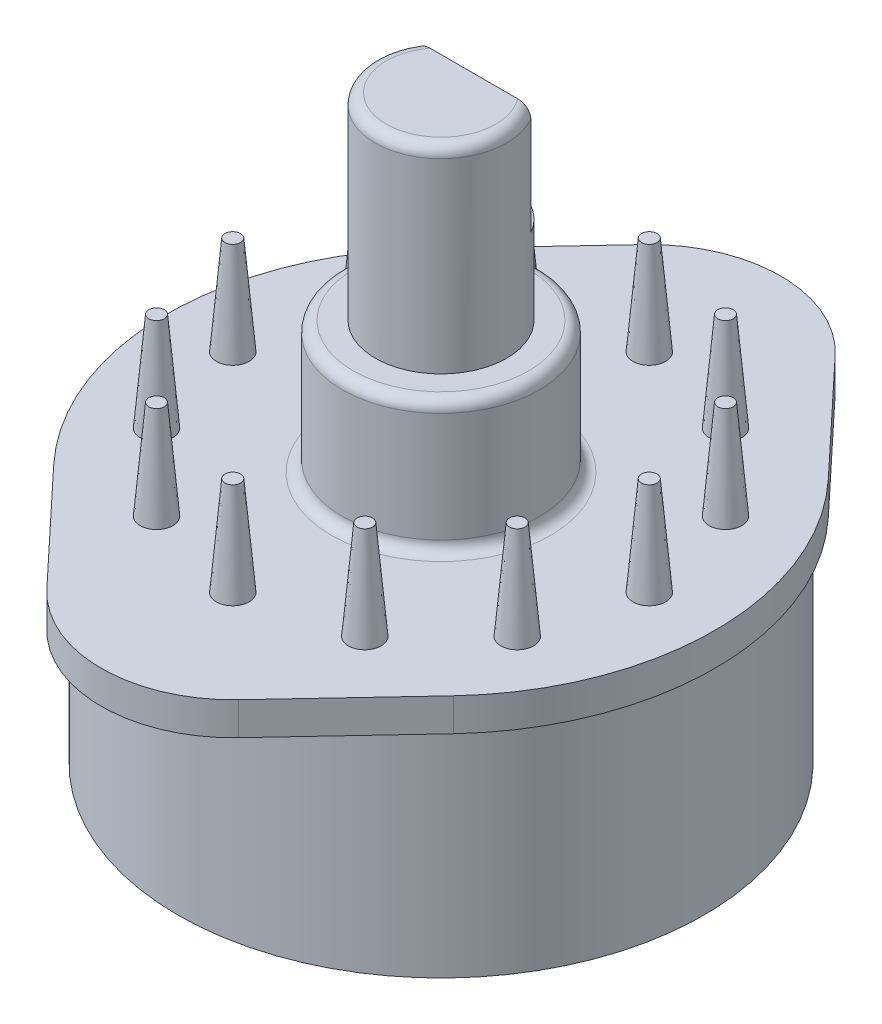
ISO-10303-21;
HEADER;
FILE_DESCRIPTION(('STEP AP214'),'2;1');
FILE_NAME('part.step','',(''),(''),'','','');
FILE_SCHEMA(('AUTOMOTIVE_DESIGN { 1 0 10303 214 1 1 1 1 }'));
ENDSEC;
DATA;
#1=APPLICATION_CONTEXT('core data for automotive mechanical design processes');
#2=APPLICATION_PROTOCOL_DEFINITION('international standard','automotive_design',2000,#1);
#3=PRODUCT_CONTEXT('',#1,'mechanical');
#4=PRODUCT('Part','Part','',(#3));
#5=PRODUCT_RELATED_PRODUCT_CATEGORY('part','',(#4));
#6=PRODUCT_DEFINITION_FORMATION('','',#4);
#7=PRODUCT_DEFINITION_CONTEXT('part definition',#1,'design');
#8=PRODUCT_DEFINITION('design','',#6,#7);
#9=PRODUCT_DEFINITION_SHAPE('','',#8);
#10=(LENGTH_UNIT() NAMED_UNIT(*) SI_UNIT(.MILLI.,.METRE.));
#11=(NAMED_UNIT(*) PLANE_ANGLE_UNIT() SI_UNIT($,.RADIAN.));
#12=(NAMED_UNIT(*) SI_UNIT($,.STERADIAN.) SOLID_ANGLE_UNIT());
#13=UNCERTAINTY_MEASURE_WITH_UNIT(LENGTH_MEASURE(1.E-05),#10,'distance_accuracy_value','');
#14=(GEOMETRIC_REPRESENTATION_CONTEXT(3) GLOBAL_UNCERTAINTY_ASSIGNED_CONTEXT((#13)) GLOBAL_UNIT_ASSIGNED_CONTEXT((#10,
#11,#12)) REPRESENTATION_CONTEXT('',''));
#15=CARTESIAN_POINT('',(0.,0.,0.));
#16=DIRECTION('',(0.,0.,1.));
#17=DIRECTION('',(1.,0.,0.));
#18=AXIS2_PLACEMENT_3D('',#15,#16,#17);
#19=CARTESIAN_POINT('',(0.,26.5,0.));
#20=DIRECTION('',(0.,1.,0.));
#21=DIRECTION('',(0.,0.,1.));
#22=AXIS2_PLACEMENT_3D('',#19,#20,#21);
#23=PLANE('',#22);
#24=DIRECTION('',(1.,0.,0.));
#25=VECTOR('',#24,1.);
#26=CARTESIAN_POINT('',(2.59807621135332,26.5,-1.5));
#27=LINE('',#26,#25);
#28=CARTESIAN_POINT('',(-2.,26.5,-1.5));
#29=VERTEX_POINT('',#28);
#30=CARTESIAN_POINT('',(2.,26.5,-1.5));
#31=VERTEX_POINT('',#30);
#32=EDGE_CURVE('E185',#29,#31,#27,.T.);
#33=ORIENTED_EDGE('',*,*,#32,.F.);
#34=CARTESIAN_POINT('',(0.,26.5,0.));
#35=DIRECTION('',(0.,1.,0.));
#36=DIRECTION('',(0.,0.,1.));
#37=AXIS2_PLACEMENT_3D('',#34,#35,#36);
#38=CIRCLE('',#37,2.5);
#39=EDGE_CURVE('E44',#29,#31,#38,.T.);
#40=ORIENTED_EDGE('',*,*,#39,.T.);
#41=EDGE_LOOP('',(#33,#40));
#42=FACE_BOUND('',#41,.T.);
#43=ADVANCED_FACE('F35',(#42),#23,.T.);
#44=CARTESIAN_POINT('',(0.,0.,0.));
#45=DIRECTION('',(0.,-1.,0.));
#46=DIRECTION('',(0.,0.,-1.));
#47=AXIS2_PLACEMENT_3D('',#44,#45,#46);
#48=CYLINDRICAL_SURFACE('',#47,3.);
#49=DIRECTION('',(0.,1.,0.));
#50=VECTOR('',#49,1.);
#51=CARTESIAN_POINT('',(2.59807621135332,21.5,-1.5));
#52=LINE('',#51,#50);
#53=CARTESIAN_POINT('',(2.59807621135332,21.5,-1.5));
#54=VERTEX_POINT('',#53);
#55=CARTESIAN_POINT('',(2.59807621135332,26.,-1.5));
#56=VERTEX_POINT('',#55);
#57=EDGE_CURVE('E203',#54,#56,#52,.T.);
#58=ORIENTED_EDGE('',*,*,#57,.T.);
#59=CARTESIAN_POINT('',(0.,26.,0.));
#60=DIRECTION('',(0.,1.,0.));
#61=DIRECTION('',(0.,0.,1.));
#62=AXIS2_PLACEMENT_3D('',#59,#60,#61);
#63=CIRCLE('',#62,3.);
#64=CARTESIAN_POINT('',(-2.59807621135332,26.,-1.5));
#65=VERTEX_POINT('',#64);
#66=EDGE_CURVE('E234',#56,#65,#63,.F.);
#67=ORIENTED_EDGE('',*,*,#66,.T.);
#68=DIRECTION('',(0.,1.,0.));
#69=VECTOR('',#68,1.);
#70=CARTESIAN_POINT('',(-2.59807621135332,21.5,-1.5));
#71=LINE('',#70,#69);
#72=CARTESIAN_POINT('',(-2.59807621135332,21.5,-1.5));
#73=VERTEX_POINT('',#72);
#74=EDGE_CURVE('E201',#73,#65,#71,.T.);
#75=ORIENTED_EDGE('',*,*,#74,.F.);
#76=CARTESIAN_POINT('',(0.,21.5,0.));
#77=DIRECTION('',(0.,1.,0.));
#78=DIRECTION('',(0.,0.,1.));
#79=AXIS2_PLACEMENT_3D('',#76,#77,#78);
#80=CIRCLE('',#79,3.);
#81=EDGE_CURVE('E197',#54,#73,#80,.T.);
#82=ORIENTED_EDGE('',*,*,#81,.F.);
#83=EDGE_LOOP('',(#58,#67,#75,#82));
#84=FACE_BOUND('',#83,.T.);
#85=CARTESIAN_POINT('',(0.,17.5,0.));
#86=DIRECTION('',(0.,-1.,0.));
#87=DIRECTION('',(0.,0.,-1.));
#88=AXIS2_PLACEMENT_3D('',#85,#86,#87);
#89=CIRCLE('',#88,3.);
#90=CARTESIAN_POINT('',(0.,17.5,-3.));
#91=VERTEX_POINT('',#90);
#92=EDGE_CURVE('E213',#91,#91,#89,.T.);
#93=ORIENTED_EDGE('',*,*,#92,.F.);
#94=EDGE_LOOP('',(#93));
#95=FACE_BOUND('',#94,.T.);
#96=ADVANCED_FACE('F285',(#84,#95),#48,.T.);
#97=CARTESIAN_POINT('',(0.,17.5,-3.));
#98=DIRECTION('',(0.,1.,0.));
#99=DIRECTION('',(0.,0.,1.));
#100=AXIS2_PLACEMENT_3D('',#97,#98,#99);
#101=PLANE('',#100);
#102=CARTESIAN_POINT('',(0.,17.5,0.));
#103=DIRECTION('',(0.,1.,0.));
#104=DIRECTION('',(0.,0.,1.));
#105=AXIS2_PLACEMENT_3D('',#102,#103,#104);
#106=CIRCLE('',#105,4.);
#107=CARTESIAN_POINT('',(0.,17.5,4.));
#108=VERTEX_POINT('',#107);
#109=EDGE_CURVE('E231',#108,#108,#106,.T.);
#110=ORIENTED_EDGE('',*,*,#109,.T.);
#111=EDGE_LOOP('',(#110));
#112=FACE_BOUND('',#111,.T.);
#113=ORIENTED_EDGE('',*,*,#92,.T.);
#114=EDGE_LOOP('',(#113));
#115=FACE_BOUND('',#114,.T.);
#116=ADVANCED_FACE('F281',(#112,#115),#101,.T.);
#117=CARTESIAN_POINT('',(0.,0.,0.));
#118=DIRECTION('',(0.,-1.,0.));
#119=DIRECTION('',(0.,0.,-1.));
#120=AXIS2_PLACEMENT_3D('',#117,#118,#119);
#121=CYLINDRICAL_SURFACE('',#120,4.5);
#122=CARTESIAN_POINT('',(0.,12.,0.));
#123=DIRECTION('',(0.,1.,0.));
#124=DIRECTION('',(0.,0.,1.));
#125=AXIS2_PLACEMENT_3D('',#122,#123,#124);
#126=CIRCLE('',#125,4.5);
#127=CARTESIAN_POINT('',(0.,12.,4.5));
#128=VERTEX_POINT('',#127);
#129=EDGE_CURVE('E228',#128,#128,#126,.T.);
#130=ORIENTED_EDGE('',*,*,#129,.T.);
#131=EDGE_LOOP('',(#130));
#132=FACE_BOUND('',#131,.T.);
#133=CARTESIAN_POINT('',(0.,17.,0.));
#134=DIRECTION('',(0.,1.,0.));
#135=DIRECTION('',(0.,0.,1.));
#136=AXIS2_PLACEMENT_3D('',#133,#134,#135);
#137=CIRCLE('',#136,4.5);
#138=CARTESIAN_POINT('',(0.,17.,4.5));
#139=VERTEX_POINT('',#138);
#140=EDGE_CURVE('E225',#139,#139,#137,.F.);
#141=ORIENTED_EDGE('',*,*,#140,.T.);
#142=EDGE_LOOP('',(#141));
#143=FACE_BOUND('',#142,.T.);
#144=ADVANCED_FACE('F277',(#132,#143),#121,.T.);
#145=CARTESIAN_POINT('',(0.,11.5,-4.5));
#146=DIRECTION('',(0.,1.,0.));
#147=DIRECTION('',(0.,0.,1.));
#148=AXIS2_PLACEMENT_3D('',#145,#146,#147);
#149=PLANE('',#148);
#150=CARTESIAN_POINT('',(4.74999999999989,11.5,8.22724133595223));
#151=DIRECTION('',(0.,1.,0.));
#152=DIRECTION('',(0.,0.,1.));
#153=AXIS2_PLACEMENT_3D('',#150,#151,#152);
#154=CIRCLE('',#153,0.75);
#155=CARTESIAN_POINT('',(4.74999999999989,11.5,8.97724133595223));
#156=VERTEX_POINT('',#155);
#157=EDGE_CURVE('E697',#156,#156,#154,.T.);
#158=ORIENTED_EDGE('',*,*,#157,.F.);
#159=EDGE_LOOP('',(#158));
#160=FACE_BOUND('',#159,.T.);
#161=CARTESIAN_POINT('',(8.22724133595211,11.5,4.7500000000001));
#162=DIRECTION('',(0.,1.,0.));
#163=DIRECTION('',(0.,0.,1.));
#164=AXIS2_PLACEMENT_3D('',#161,#162,#163);
#165=CIRCLE('',#164,0.750000000000001);
#166=CARTESIAN_POINT('',(8.22724133595211,11.5,5.5000000000001));
#167=VERTEX_POINT('',#166);
#168=EDGE_CURVE('E696',#167,#167,#165,.T.);
#169=ORIENTED_EDGE('',*,*,#168,.F.);
#170=EDGE_LOOP('',(#169));
#171=FACE_BOUND('',#170,.T.);
#172=CARTESIAN_POINT('',(9.5,11.5,0.));
#173=DIRECTION('',(0.,1.,0.));
#174=DIRECTION('',(0.,0.,1.));
#175=AXIS2_PLACEMENT_3D('',#172,#173,#174);
#176=CIRCLE('',#175,0.75);
#177=CARTESIAN_POINT('',(9.5,11.5,0.7500000000001));
#178=VERTEX_POINT('',#177);
#179=EDGE_CURVE('E707',#178,#178,#176,.T.);
#180=ORIENTED_EDGE('',*,*,#179,.F.);
#181=EDGE_LOOP('',(#180));
#182=FACE_BOUND('',#181,.T.);
#183=CARTESIAN_POINT('',(8.22724133595221,11.5,-4.74999999999992));
#184=DIRECTION('',(0.,1.,0.));
#185=DIRECTION('',(0.,0.,1.));
#186=AXIS2_PLACEMENT_3D('',#183,#184,#185);
#187=CIRCLE('',#186,0.75);
#188=CARTESIAN_POINT('',(8.22724133595221,11.5,-3.99999999999992));
#189=VERTEX_POINT('',#188);
#190=EDGE_CURVE('E713',#189,#189,#187,.T.);
#191=ORIENTED_EDGE('',*,*,#190,.F.);
#192=EDGE_LOOP('',(#191));
#193=FACE_BOUND('',#192,.T.);
#194=CARTESIAN_POINT('',(4.75000000000007,11.5,-8.22724133595213));
#195=DIRECTION('',(0.,1.,0.));
#196=DIRECTION('',(0.,0.,1.));
#197=AXIS2_PLACEMENT_3D('',#194,#195,#196);
#198=CIRCLE('',#197,0.75);
#199=CARTESIAN_POINT('',(4.75000000000007,11.5,-7.47724133595213));
#200=VERTEX_POINT('',#199);
#201=EDGE_CURVE('E719',#200,#200,#198,.T.);
#202=ORIENTED_EDGE('',*,*,#201,.F.);
#203=EDGE_LOOP('',(#202));
#204=FACE_BOUND('',#203,.T.);
#205=CARTESIAN_POINT('',(0.,11.5,-9.5));
#206=DIRECTION('',(0.,1.,0.));
#207=DIRECTION('',(0.,0.,1.));
#208=AXIS2_PLACEMENT_3D('',#205,#206,#207);
#209=CIRCLE('',#208,0.75);
#210=CARTESIAN_POINT('',(0.,11.5,-8.75));
#211=VERTEX_POINT('',#210);
#212=EDGE_CURVE('E725',#211,#211,#209,.T.);
#213=ORIENTED_EDGE('',*,*,#212,.F.);
#214=EDGE_LOOP('',(#213));
#215=FACE_BOUND('',#214,.T.);
#216=CARTESIAN_POINT('',(-4.74999999999995,11.5,-8.2272413359522));
#217=DIRECTION('',(0.,1.,0.));
#218=DIRECTION('',(0.,0.,1.));
#219=AXIS2_PLACEMENT_3D('',#216,#217,#218);
#220=CIRCLE('',#219,0.75);
#221=CARTESIAN_POINT('',(-4.74999999999995,11.5,-7.47724133595219));
#222=VERTEX_POINT('',#221);
#223=EDGE_CURVE('E731',#222,#222,#220,.T.);
#224=ORIENTED_EDGE('',*,*,#223,.F.);
#225=EDGE_LOOP('',(#224));
#226=FACE_BOUND('',#225,.T.);
#227=CARTESIAN_POINT('',(-8.22724133595215,11.5,-4.75000000000004));
#228=DIRECTION('',(0.,1.,0.));
#229=DIRECTION('',(0.,0.,1.));
#230=AXIS2_PLACEMENT_3D('',#227,#228,#229);
#231=CIRCLE('',#230,0.75);
#232=CARTESIAN_POINT('',(-8.22724133595215,11.5,-4.00000000000004));
#233=VERTEX_POINT('',#232);
#234=EDGE_CURVE('E737',#233,#233,#231,.T.);
#235=ORIENTED_EDGE('',*,*,#234,.F.);
#236=EDGE_LOOP('',(#235));
#237=FACE_BOUND('',#236,.T.);
#238=CARTESIAN_POINT('',(-9.5,11.5,0.));
#239=DIRECTION('',(0.,1.,0.));
#240=DIRECTION('',(0.,0.,1.));
#241=AXIS2_PLACEMENT_3D('',#238,#239,#240);
#242=CIRCLE('',#241,0.75);
#243=CARTESIAN_POINT('',(-9.5,11.5,0.749999999999967));
#244=VERTEX_POINT('',#243);
#245=EDGE_CURVE('E743',#244,#244,#242,.T.);
#246=ORIENTED_EDGE('',*,*,#245,.F.);
#247=EDGE_LOOP('',(#246));
#248=FACE_BOUND('',#247,.T.);
#249=CARTESIAN_POINT('',(-8.22724133595218,11.5,4.74999999999998));
#250=DIRECTION('',(0.,1.,0.));
#251=DIRECTION('',(0.,0.,1.));
#252=AXIS2_PLACEMENT_3D('',#249,#250,#251);
#253=CIRCLE('',#252,0.749999999999999);
#254=CARTESIAN_POINT('',(-8.22724133595218,11.5,5.49999999999998));
#255=VERTEX_POINT('',#254);
#256=EDGE_CURVE('E749',#255,#255,#253,.T.);
#257=ORIENTED_EDGE('',*,*,#256,.F.);
#258=EDGE_LOOP('',(#257));
#259=FACE_BOUND('',#258,.T.);
#260=CARTESIAN_POINT('',(-4.75000000000001,11.5,8.22724133595216));
#261=DIRECTION('',(0.,1.,0.));
#262=DIRECTION('',(0.,0.,1.));
#263=AXIS2_PLACEMENT_3D('',#260,#261,#262);
#264=CIRCLE('',#263,0.75);
#265=CARTESIAN_POINT('',(-4.75000000000001,11.5,8.97724133595216));
#266=VERTEX_POINT('',#265);
#267=EDGE_CURVE('E755',#266,#266,#264,.T.);
#268=ORIENTED_EDGE('',*,*,#267,.F.);
#269=EDGE_LOOP('',(#268));
#270=FACE_BOUND('',#269,.T.);
#271=CARTESIAN_POINT('',(0.,11.5,9.5));
#272=DIRECTION('',(0.,1.,0.));
#273=DIRECTION('',(0.,0.,1.));
#274=AXIS2_PLACEMENT_3D('',#271,#272,#273);
#275=CIRCLE('',#274,0.75);
#276=CARTESIAN_POINT('',(0.,11.5,10.25));
#277=VERTEX_POINT('',#276);
#278=EDGE_CURVE('E760',#277,#277,#275,.T.);
#279=ORIENTED_EDGE('',*,*,#278,.F.);
#280=EDGE_LOOP('',(#279));
#281=FACE_BOUND('',#280,.T.);
#282=CARTESIAN_POINT('',(0.,11.5,0.));
#283=DIRECTION('',(0.,1.,0.));
#284=DIRECTION('',(0.,0.,1.));
#285=AXIS2_PLACEMENT_3D('',#282,#283,#284);
#286=CIRCLE('',#285,5.);
#287=CARTESIAN_POINT('',(0.,11.5,5.));
#288=VERTEX_POINT('',#287);
#289=EDGE_CURVE('E222',#288,#288,#286,.F.);
#290=ORIENTED_EDGE('',*,*,#289,.T.);
#291=EDGE_LOOP('',(#290));
#292=FACE_BOUND('',#291,.T.);
#293=CARTESIAN_POINT('',(0.,11.5,-9.5));
#294=DIRECTION('',(0.,1.,0.));
#295=DIRECTION('',(0.,0.,-1.));
#296=AXIS2_PLACEMENT_3D('',#293,#294,#295);
#297=CIRCLE('',#296,6.);
#298=CARTESIAN_POINT('',(4.3757073033319,11.5,-13.6052631578947));
#299=VERTEX_POINT('',#298);
#300=CARTESIAN_POINT('',(-4.3757073033319,11.5,-13.6052631578947));
#301=VERTEX_POINT('',#300);
#302=EDGE_CURVE('E167',#299,#301,#297,.T.);
#303=ORIENTED_EDGE('',*,*,#302,.T.);
#304=DIRECTION('',(-0.68421052631579,0.,0.729284550555316));
#305=VECTOR('',#304,1.);
#306=CARTESIAN_POINT('',(-9.11605688194146,11.5,-8.55263157894737));
#307=LINE('',#306,#305);
#308=CARTESIAN_POINT('',(-9.11605688194146,11.5,-8.55263157894737));
#309=VERTEX_POINT('',#308);
#310=EDGE_CURVE('E123',#301,#309,#307,.T.);
#311=ORIENTED_EDGE('',*,*,#310,.T.);
#312=CARTESIAN_POINT('',(0.,11.5,0.));
#313=DIRECTION('',(0.,1.,0.));
#314=DIRECTION('',(0.,0.,1.));
#315=AXIS2_PLACEMENT_3D('',#312,#313,#314);
#316=CIRCLE('',#315,12.5);
#317=CARTESIAN_POINT('',(-9.11605688194146,11.5,8.55263157894737));
#318=VERTEX_POINT('',#317);
#319=EDGE_CURVE('E170',#309,#318,#316,.T.);
#320=ORIENTED_EDGE('',*,*,#319,.T.);
#321=DIRECTION('',(0.684210526315789,0.,0.729284550555317));
#322=VECTOR('',#321,1.);
#323=CARTESIAN_POINT('',(-9.11605688194146,11.5,8.55263157894737));
#324=LINE('',#323,#322);
#325=CARTESIAN_POINT('',(-4.3757073033319,11.5,13.6052631578947));
#326=VERTEX_POINT('',#325);
#327=EDGE_CURVE('E173',#318,#326,#324,.T.);
#328=ORIENTED_EDGE('',*,*,#327,.T.);
#329=CARTESIAN_POINT('',(0.,11.5,9.5));
#330=DIRECTION('',(0.,1.,0.));
#331=DIRECTION('',(0.,0.,1.));
#332=AXIS2_PLACEMENT_3D('',#329,#330,#331);
#333=CIRCLE('',#332,6.);
#334=CARTESIAN_POINT('',(4.3757073033319,11.5,13.6052631578947));
#335=VERTEX_POINT('',#334);
#336=EDGE_CURVE('E176',#326,#335,#333,.T.);
#337=ORIENTED_EDGE('',*,*,#336,.T.);
#338=DIRECTION('',(0.684210526315789,0.,-0.729284550555317));
#339=VECTOR('',#338,1.);
#340=CARTESIAN_POINT('',(9.11605688194146,11.5,8.55263157894737));
#341=LINE('',#340,#339);
#342=CARTESIAN_POINT('',(9.11605688194146,11.5,8.55263157894737));
#343=VERTEX_POINT('',#342);
#344=EDGE_CURVE('E179',#335,#343,#341,.T.);
#345=ORIENTED_EDGE('',*,*,#344,.T.);
#346=CARTESIAN_POINT('',(0.,11.5,0.));
#347=DIRECTION('',(0.,1.,0.));
#348=DIRECTION('',(0.,0.,-1.));
#349=AXIS2_PLACEMENT_3D('',#346,#347,#348);
#350=CIRCLE('',#349,12.5);
#351=CARTESIAN_POINT('',(9.11605688194146,11.5,-8.55263157894737));
#352=VERTEX_POINT('',#351);
#353=EDGE_CURVE('E147',#343,#352,#350,.T.);
#354=ORIENTED_EDGE('',*,*,#353,.T.);
#355=DIRECTION('',(-0.684210526315789,0.,-0.729284550555317));
#356=VECTOR('',#355,1.);
#357=CARTESIAN_POINT('',(4.3757073033319,11.5,-13.6052631578947));
#358=LINE('',#357,#356);
#359=EDGE_CURVE('E144',#352,#299,#358,.T.);
#360=ORIENTED_EDGE('',*,*,#359,.T.);
#361=EDGE_LOOP('',(#303,#311,#320,#328,#337,#345,#354,#360));
#362=FACE_BOUND('',#361,.T.);
#363=ADVANCED_FACE('F254',(#160,#171,#182,#193,#204,#215,#226,#237,#248,#259,#270,#281,#292,
#362),#149,.T.);
#364=CARTESIAN_POINT('',(2.59807621135332,21.5,-1.5));
#365=DIRECTION('',(0.,0.,1.));
#366=DIRECTION('',(1.,0.,0.));
#367=AXIS2_PLACEMENT_3D('',#364,#365,#366);
#368=PLANE('',#367);
#369=ORIENTED_EDGE('',*,*,#74,.T.);
#370=CARTESIAN_POINT('',(-2.59807621135332,26.,-1.5));
#371=CARTESIAN_POINT('',(-2.59811196072702,26.0252993719255,-1.5));
#372=CARTESIAN_POINT('',(-2.595861638518,26.0505737735609,-1.5));
#373=CARTESIAN_POINT('',(-2.58707466976209,26.1002667127125,-1.5));
#374=CARTESIAN_POINT('',(-2.58055505959201,26.1246882472568,-1.5));
#375=CARTESIAN_POINT('',(-2.56351678155422,26.1720661649538,-1.5));
#376=CARTESIAN_POINT('',(-2.55300068650816,26.1950234796481,-1.5));
#377=CARTESIAN_POINT('',(-2.52842196305361,26.2389618451268,-1.5));
#378=CARTESIAN_POINT('',(-2.51435670551403,26.2599414149518,-1.5));
#379=CARTESIAN_POINT('',(-2.48251028145274,26.3003953570351,-1.5));
#380=CARTESIAN_POINT('',(-2.46459130048682,26.3197607793731,-1.5));
#381=CARTESIAN_POINT('',(-2.4260869712423,26.3556027496572,-1.5));
#382=CARTESIAN_POINT('',(-2.40550159936641,26.3720792720337,-1.5));
#383=CARTESIAN_POINT('',(-2.35957063995424,26.4038714824211,-1.5));
#384=CARTESIAN_POINT('',(-2.33395125366987,26.4187906923712,-1.5));
#385=CARTESIAN_POINT('',(-2.2808042061272,26.4448094680057,-1.5));
#386=CARTESIAN_POINT('',(-2.25327299103756,26.4559016784147,-1.5));
#387=CARTESIAN_POINT('',(-2.1888267952883,26.476984139307,-1.5));
#388=CARTESIAN_POINT('',(-2.15150414576989,26.4857239730776,-1.5));
#389=CARTESIAN_POINT('',(-2.07608571927432,26.4972264524269,-1.5));
#390=CARTESIAN_POINT('',(-2.03799352681164,26.5000122852115,-1.5));
#391=CARTESIAN_POINT('',(-2.,26.5,-1.5));
#392=B_SPLINE_CURVE_WITH_KNOTS('',3,(#370,#371,#372,#373,#374,#375,#376,#377,#378,#379,#380,
#381,#382,#383,#384,#385,#386,#387,#388,#389,#390,#391),.UNSPECIFIED.,.F.,.F.,(4,2,2,2,2,2,2,2,
2,2,4),(0.,0.0757591233474407,0.151217761038703,0.2266279027013,0.30209407115615,
0.380927961171617,0.459762548906753,0.548360473572332,0.637127742045012,0.751613871876682,
0.865653329399307),.UNSPECIFIED.);
#393=EDGE_CURVE('E56',#65,#29,#392,.T.);
#394=ORIENTED_EDGE('',*,*,#393,.T.);
#395=ORIENTED_EDGE('',*,*,#32,.T.);
#396=CARTESIAN_POINT('',(2.,26.5,-1.5));
#397=CARTESIAN_POINT('',(2.04231344226848,26.5000225744386,-1.5));
#398=CARTESIAN_POINT('',(2.08478167890287,26.4965587809135,-1.5));
#399=CARTESIAN_POINT('',(2.16865687069638,26.4822089293933,-1.5));
#400=CARTESIAN_POINT('',(2.21005701299852,26.4712836544818,-1.5));
#401=CARTESIAN_POINT('',(2.28066063514122,26.4450067667612,-1.5));
#402=CARTESIAN_POINT('',(2.31046267784929,26.4312738115768,-1.5));
#403=CARTESIAN_POINT('',(2.3673754617436,26.3991227596818,-1.5));
#404=CARTESIAN_POINT('',(2.39449167061987,26.3807144651127,-1.5));
#405=CARTESIAN_POINT('',(2.44522673806277,26.3391557484011,-1.5));
#406=CARTESIAN_POINT('',(2.46881485275439,26.3159674058408,-1.5));
#407=CARTESIAN_POINT('',(2.51100399520925,26.265379272632,-1.5));
#408=CARTESIAN_POINT('',(2.52960576125189,26.2379801063847,-1.5));
#409=CARTESIAN_POINT('',(2.55848982720331,26.1838891120657,-1.5));
#410=CARTESIAN_POINT('',(2.56956488519975,26.1576191527535,-1.5));
#411=CARTESIAN_POINT('',(2.586494590668,26.1034793591107,-1.5));
#412=CARTESIAN_POINT('',(2.59236319238111,26.0756140156606,-1.5));
#413=CARTESIAN_POINT('',(2.59633581745279,26.0396034650578,-1.5));
#414=CARTESIAN_POINT('',(2.59698853049942,26.0316909154171,-1.5));
#415=CARTESIAN_POINT('',(2.59785802652244,26.0158535584078,-1.5));
#416=CARTESIAN_POINT('',(2.59807544927391,26.0079287861863,-1.5));
#417=CARTESIAN_POINT('',(2.59807621135333,26.,-1.5));
#418=B_SPLINE_CURVE_WITH_KNOTS('',3,(#396,#397,#398,#399,#400,#401,#402,#403,#404,#405,#406,
#407,#408,#409,#410,#411,#412,#413,#414,#415,#416,#417),.UNSPECIFIED.,.F.,.F.,(4,2,2,2,2,2,2,2,
2,2,4),(0.,0.127051222133735,0.254775406539546,0.352817764178737,0.450656242655142,
0.549303008007082,0.647935159629031,0.732989332518061,0.817814850143192,0.841625239172113,
0.865400606721639),.UNSPECIFIED.);
#419=EDGE_CURVE('E237',#31,#56,#418,.T.);
#420=ORIENTED_EDGE('',*,*,#419,.T.);
#421=ORIENTED_EDGE('',*,*,#57,.F.);
#422=DIRECTION('',(1.,0.,0.));
#423=VECTOR('',#422,1.);
#424=CARTESIAN_POINT('',(2.59807621135332,21.5,-1.5));
#425=LINE('',#424,#423);
#426=EDGE_CURVE('E199',#73,#54,#425,.T.);
#427=ORIENTED_EDGE('',*,*,#426,.F.);
#428=EDGE_LOOP('',(#369,#394,#395,#420,#421,#427));
#429=FACE_BOUND('',#428,.T.);
#430=ADVANCED_FACE('F248',(#429),#368,.F.);
#431=CARTESIAN_POINT('',(0.,21.5,0.));
#432=DIRECTION('',(0.,1.,0.));
#433=DIRECTION('',(0.,0.,1.));
#434=AXIS2_PLACEMENT_3D('',#431,#432,#433);
#435=PLANE('',#434);
#436=ORIENTED_EDGE('',*,*,#81,.T.);
#437=ORIENTED_EDGE('',*,*,#426,.T.);
#438=EDGE_LOOP('',(#436,#437));
#439=FACE_BOUND('',#438,.T.);
#440=ADVANCED_FACE('F253',(#439),#435,.T.);
#441=CARTESIAN_POINT('',(0.,12.,0.));
#442=DIRECTION('',(0.,1.,0.));
#443=DIRECTION('',(0.,0.,1.));
#444=AXIS2_PLACEMENT_3D('',#441,#442,#443);
#445=TOROIDAL_SURFACE('',#444,5.,0.5);
#446=ORIENTED_EDGE('',*,*,#129,.F.);
#447=EDGE_LOOP('',(#446));
#448=FACE_BOUND('',#447,.T.);
#449=ORIENTED_EDGE('',*,*,#289,.F.);
#450=EDGE_LOOP('',(#449));
#451=FACE_BOUND('',#450,.T.);
#452=ADVANCED_FACE('F295',(#448,#451),#445,.F.);
#453=CARTESIAN_POINT('',(0.,17.,0.));
#454=DIRECTION('',(0.,1.,0.));
#455=DIRECTION('',(0.,0.,1.));
#456=AXIS2_PLACEMENT_3D('',#453,#454,#455);
#457=TOROIDAL_SURFACE('',#456,4.,0.5);
#458=ORIENTED_EDGE('',*,*,#109,.F.);
#459=EDGE_LOOP('',(#458));
#460=FACE_BOUND('',#459,.T.);
#461=ORIENTED_EDGE('',*,*,#140,.F.);
#462=EDGE_LOOP('',(#461));
#463=FACE_BOUND('',#462,.T.);
#464=ADVANCED_FACE('F297',(#460,#463),#457,.T.);
#465=CARTESIAN_POINT('',(0.,26.,0.));
#466=DIRECTION('',(0.,1.,0.));
#467=DIRECTION('',(0.,0.,1.));
#468=AXIS2_PLACEMENT_3D('',#465,#466,#467);
#469=TOROIDAL_SURFACE('',#468,2.5,0.5);
#470=ORIENTED_EDGE('',*,*,#419,.F.);
#471=ORIENTED_EDGE('',*,*,#39,.F.);
#472=ORIENTED_EDGE('',*,*,#393,.F.);
#473=ORIENTED_EDGE('',*,*,#66,.F.);
#474=EDGE_LOOP('',(#470,#471,#472,#473));
#475=FACE_BOUND('',#474,.T.);
#476=ADVANCED_FACE('F37',(#475),#469,.T.);
#477=CARTESIAN_POINT('',(0.,10.,-9.5));
#478=DIRECTION('',(0.,1.,0.));
#479=DIRECTION('',(0.,0.,1.));
#480=AXIS2_PLACEMENT_3D('',#477,#478,#479);
#481=CYLINDRICAL_SURFACE('',#480,6.);
#482=ORIENTED_EDGE('',*,*,#302,.F.);
#483=DIRECTION('',(0.,1.,0.));
#484=VECTOR('',#483,1.);
#485=CARTESIAN_POINT('',(4.3757073033319,10.,-13.6052631578947));
#486=LINE('',#485,#484);
#487=CARTESIAN_POINT('',(4.3757073033319,10.,-13.6052631578947));
#488=VERTEX_POINT('',#487);
#489=EDGE_CURVE('E143',#488,#299,#486,.T.);
#490=ORIENTED_EDGE('',*,*,#489,.F.);
#491=CARTESIAN_POINT('',(0.,10.,-9.5));
#492=DIRECTION('',(0.,1.,0.));
#493=DIRECTION('',(0.,0.,-1.));
#494=AXIS2_PLACEMENT_3D('',#491,#492,#493);
#495=CIRCLE('',#494,6.);
#496=CARTESIAN_POINT('',(-4.3757073033319,10.,-13.6052631578947));
#497=VERTEX_POINT('',#496);
#498=EDGE_CURVE('E136',#488,#497,#495,.T.);
#499=ORIENTED_EDGE('',*,*,#498,.T.);
#500=DIRECTION('',(0.,1.,0.));
#501=VECTOR('',#500,1.);
#502=CARTESIAN_POINT('',(-4.3757073033319,10.,-13.6052631578947));
#503=LINE('',#502,#501);
#504=EDGE_CURVE('E118',#497,#301,#503,.T.);
#505=ORIENTED_EDGE('',*,*,#504,.T.);
#506=EDGE_LOOP('',(#482,#490,#499,#505));
#507=FACE_BOUND('',#506,.T.);
#508=ADVANCED_FACE('F142',(#507),#481,.T.);
#509=CARTESIAN_POINT('',(4.3757073033319,10.,-13.6052631578947));
#510=DIRECTION('',(0.729284550555317,0.,-0.684210526315789));
#511=DIRECTION('',(-0.684210526315789,0.,-0.729284550555317));
#512=AXIS2_PLACEMENT_3D('',#509,#510,#511);
#513=PLANE('',#512);
#514=ORIENTED_EDGE('',*,*,#359,.F.);
#515=DIRECTION('',(0.,1.,0.));
#516=VECTOR('',#515,1.);
#517=CARTESIAN_POINT('',(9.11605688194146,10.,-8.55263157894737));
#518=LINE('',#517,#516);
#519=CARTESIAN_POINT('',(9.11605688194146,10.,-8.55263157894737));
#520=VERTEX_POINT('',#519);
#521=EDGE_CURVE('E186',#520,#352,#518,.T.);
#522=ORIENTED_EDGE('',*,*,#521,.F.);
#523=DIRECTION('',(-0.684210526315789,0.,-0.729284550555317));
#524=VECTOR('',#523,1.);
#525=CARTESIAN_POINT('',(4.3757073033319,10.,-13.6052631578947));
#526=LINE('',#525,#524);
#527=EDGE_CURVE('E129',#520,#488,#526,.T.);
#528=ORIENTED_EDGE('',*,*,#527,.T.);
#529=ORIENTED_EDGE('',*,*,#489,.T.);
#530=EDGE_LOOP('',(#514,#522,#528,#529));
#531=FACE_BOUND('',#530,.T.);
#532=ADVANCED_FACE('F316',(#531),#513,.T.);
#533=CARTESIAN_POINT('',(0.,10.,0.));
#534=DIRECTION('',(0.,1.,0.));
#535=DIRECTION('',(0.,0.,1.));
#536=AXIS2_PLACEMENT_3D('',#533,#534,#535);
#537=CYLINDRICAL_SURFACE('',#536,12.5);
#538=ORIENTED_EDGE('',*,*,#353,.F.);
#539=DIRECTION('',(0.,1.,0.));
#540=VECTOR('',#539,1.);
#541=CARTESIAN_POINT('',(9.11605688194146,10.,8.55263157894737));
#542=LINE('',#541,#540);
#543=CARTESIAN_POINT('',(9.11605688194146,10.,8.55263157894737));
#544=VERTEX_POINT('',#543);
#545=EDGE_CURVE('E188',#544,#343,#542,.T.);
#546=ORIENTED_EDGE('',*,*,#545,.F.);
#547=CARTESIAN_POINT('',(0.,10.,0.));
#548=DIRECTION('',(0.,1.,0.));
#549=DIRECTION('',(0.,0.,-1.));
#550=AXIS2_PLACEMENT_3D('',#547,#548,#549);
#551=CIRCLE('',#550,12.5);
#552=EDGE_CURVE('E163',#544,#520,#551,.T.);
#553=ORIENTED_EDGE('',*,*,#552,.T.);
#554=ORIENTED_EDGE('',*,*,#521,.T.);
#555=EDGE_LOOP('',(#538,#546,#553,#554));
#556=FACE_BOUND('',#555,.T.);
#557=ADVANCED_FACE('F364',(#556),#537,.T.);
#558=CARTESIAN_POINT('',(9.11605688194146,10.,8.55263157894737));
#559=DIRECTION('',(0.729284550555317,0.,0.684210526315789));
#560=DIRECTION('',(0.684210526315789,0.,-0.729284550555317));
#561=AXIS2_PLACEMENT_3D('',#558,#559,#560);
#562=PLANE('',#561);
#563=ORIENTED_EDGE('',*,*,#344,.F.);
#564=DIRECTION('',(0.,1.,0.));
#565=VECTOR('',#564,1.);
#566=CARTESIAN_POINT('',(4.3757073033319,10.,13.6052631578947));
#567=LINE('',#566,#565);
#568=CARTESIAN_POINT('',(4.3757073033319,10.,13.6052631578947));
#569=VERTEX_POINT('',#568);
#570=EDGE_CURVE('E190',#569,#335,#567,.T.);
#571=ORIENTED_EDGE('',*,*,#570,.F.);
#572=DIRECTION('',(0.684210526315789,0.,-0.729284550555317));
#573=VECTOR('',#572,1.);
#574=CARTESIAN_POINT('',(9.11605688194146,10.,8.55263157894737));
#575=LINE('',#574,#573);
#576=EDGE_CURVE('E160',#569,#544,#575,.T.);
#577=ORIENTED_EDGE('',*,*,#576,.T.);
#578=ORIENTED_EDGE('',*,*,#545,.T.);
#579=EDGE_LOOP('',(#563,#571,#577,#578));
#580=FACE_BOUND('',#579,.T.);
#581=ADVANCED_FACE('F375',(#580),#562,.T.);
#582=CARTESIAN_POINT('',(0.,10.,9.5));
#583=DIRECTION('',(0.,1.,0.));
#584=DIRECTION('',(0.,0.,1.));
#585=AXIS2_PLACEMENT_3D('',#582,#583,#584);
#586=CYLINDRICAL_SURFACE('',#585,6.);
#587=ORIENTED_EDGE('',*,*,#336,.F.);
#588=DIRECTION('',(0.,1.,0.));
#589=VECTOR('',#588,1.);
#590=CARTESIAN_POINT('',(-4.3757073033319,10.,13.6052631578947));
#591=LINE('',#590,#589);
#592=CARTESIAN_POINT('',(-4.3757073033319,10.,13.6052631578947));
#593=VERTEX_POINT('',#592);
#594=EDGE_CURVE('E192',#593,#326,#591,.T.);
#595=ORIENTED_EDGE('',*,*,#594,.F.);
#596=CARTESIAN_POINT('',(0.,10.,9.5));
#597=DIRECTION('',(0.,1.,0.));
#598=DIRECTION('',(0.,0.,1.));
#599=AXIS2_PLACEMENT_3D('',#596,#597,#598);
#600=CIRCLE('',#599,6.);
#601=EDGE_CURVE('E157',#593,#569,#600,.T.);
#602=ORIENTED_EDGE('',*,*,#601,.T.);
#603=ORIENTED_EDGE('',*,*,#570,.T.);
#604=EDGE_LOOP('',(#587,#595,#602,#603));
#605=FACE_BOUND('',#604,.T.);
#606=ADVANCED_FACE('F386',(#605),#586,.T.);
#607=CARTESIAN_POINT('',(-9.11605688194146,10.,8.55263157894737));
#608=DIRECTION('',(-0.729284550555317,0.,0.684210526315789));
#609=DIRECTION('',(0.684210526315789,0.,0.729284550555317));
#610=AXIS2_PLACEMENT_3D('',#607,#608,#609);
#611=PLANE('',#610);
#612=ORIENTED_EDGE('',*,*,#327,.F.);
#613=DIRECTION('',(0.,1.,0.));
#614=VECTOR('',#613,1.);
#615=CARTESIAN_POINT('',(-9.11605688194146,10.,8.55263157894737));
#616=LINE('',#615,#614);
#617=CARTESIAN_POINT('',(-9.11605688194146,10.,8.55263157894737));
#618=VERTEX_POINT('',#617);
#619=EDGE_CURVE('E194',#618,#318,#616,.T.);
#620=ORIENTED_EDGE('',*,*,#619,.F.);
#621=DIRECTION('',(0.684210526315789,0.,0.729284550555317));
#622=VECTOR('',#621,1.);
#623=CARTESIAN_POINT('',(-9.11605688194146,10.,8.55263157894737));
#624=LINE('',#623,#622);
#625=EDGE_CURVE('E154',#618,#593,#624,.T.);
#626=ORIENTED_EDGE('',*,*,#625,.T.);
#627=ORIENTED_EDGE('',*,*,#594,.T.);
#628=EDGE_LOOP('',(#612,#620,#626,#627));
#629=FACE_BOUND('',#628,.T.);
#630=ADVANCED_FACE('F397',(#629),#611,.T.);
#631=CARTESIAN_POINT('',(0.,10.,0.));
#632=DIRECTION('',(0.,1.,0.));
#633=DIRECTION('',(0.,0.,1.));
#634=AXIS2_PLACEMENT_3D('',#631,#632,#633);
#635=CYLINDRICAL_SURFACE('',#634,12.5);
#636=ORIENTED_EDGE('',*,*,#319,.F.);
#637=DIRECTION('',(0.,1.,0.));
#638=VECTOR('',#637,1.);
#639=CARTESIAN_POINT('',(-9.11605688194146,10.,-8.55263157894737));
#640=LINE('',#639,#638);
#641=CARTESIAN_POINT('',(-9.11605688194146,10.,-8.55263157894737));
#642=VERTEX_POINT('',#641);
#643=EDGE_CURVE('E128',#642,#309,#640,.T.);
#644=ORIENTED_EDGE('',*,*,#643,.F.);
#645=CARTESIAN_POINT('',(0.,10.,0.));
#646=DIRECTION('',(0.,1.,0.));
#647=DIRECTION('',(0.,0.,1.));
#648=AXIS2_PLACEMENT_3D('',#645,#646,#647);
#649=CIRCLE('',#648,12.5);
#650=EDGE_CURVE('E140',#642,#618,#649,.T.);
#651=ORIENTED_EDGE('',*,*,#650,.T.);
#652=ORIENTED_EDGE('',*,*,#619,.T.);
#653=EDGE_LOOP('',(#636,#644,#651,#652));
#654=FACE_BOUND('',#653,.T.);
#655=ADVANCED_FACE('F408',(#654),#635,.T.);
#656=CARTESIAN_POINT('',(-9.11605688194146,10.,-8.55263157894737));
#657=DIRECTION('',(-0.729284550555316,0.,-0.68421052631579));
#658=DIRECTION('',(-0.68421052631579,0.,0.729284550555316));
#659=AXIS2_PLACEMENT_3D('',#656,#657,#658);
#660=PLANE('',#659);
#661=ORIENTED_EDGE('',*,*,#310,.F.);
#662=ORIENTED_EDGE('',*,*,#504,.F.);
#663=DIRECTION('',(-0.68421052631579,0.,0.729284550555316));
#664=VECTOR('',#663,1.);
#665=CARTESIAN_POINT('',(-9.11605688194146,10.,-8.55263157894737));
#666=LINE('',#665,#664);
#667=EDGE_CURVE('E121',#497,#642,#666,.T.);
#668=ORIENTED_EDGE('',*,*,#667,.T.);
#669=ORIENTED_EDGE('',*,*,#643,.T.);
#670=EDGE_LOOP('',(#661,#662,#668,#669));
#671=FACE_BOUND('',#670,.T.);
#672=ADVANCED_FACE('F120',(#671),#660,.T.);
#673=CARTESIAN_POINT('',(0.,10.,-9.5));
#674=DIRECTION('',(0.,-1.,0.));
#675=DIRECTION('',(0.,0.,-1.));
#676=AXIS2_PLACEMENT_3D('',#673,#674,#675);
#677=PLANE('',#676);
#678=CARTESIAN_POINT('',(0.,10.,0.));
#679=DIRECTION('',(0.,-1.,0.));
#680=DIRECTION('',(0.,0.,-1.));
#681=AXIS2_PLACEMENT_3D('',#678,#679,#680);
#682=CIRCLE('',#681,12.);
#683=CARTESIAN_POINT('',(0.,10.,-12.));
#684=VERTEX_POINT('',#683);
#685=EDGE_CURVE('E11',#684,#684,#682,.F.);
#686=ORIENTED_EDGE('',*,*,#685,.T.);
#687=EDGE_LOOP('',(#686));
#688=FACE_BOUND('',#687,.T.);
#689=ORIENTED_EDGE('',*,*,#498,.F.);
#690=ORIENTED_EDGE('',*,*,#527,.F.);
#691=ORIENTED_EDGE('',*,*,#552,.F.);
#692=ORIENTED_EDGE('',*,*,#576,.F.);
#693=ORIENTED_EDGE('',*,*,#601,.F.);
#694=ORIENTED_EDGE('',*,*,#625,.F.);
#695=ORIENTED_EDGE('',*,*,#650,.F.);
#696=ORIENTED_EDGE('',*,*,#667,.F.);
#697=EDGE_LOOP('',(#689,#690,#691,#692,#693,#694,#695,#696));
#698=FACE_BOUND('',#697,.T.);
#699=ADVANCED_FACE('F134',(#688,#698),#677,.T.);
#700=CARTESIAN_POINT('',(0.,-3.,-6.));
#701=DIRECTION('',(0.,-1.,0.));
#702=DIRECTION('',(0.,0.,-1.));
#703=AXIS2_PLACEMENT_3D('',#700,#701,#702);
#704=PLANE('',#703);
#705=CARTESIAN_POINT('',(0.,-3.,0.));
#706=DIRECTION('',(0.,-1.,0.));
#707=DIRECTION('',(0.,0.,-1.));
#708=AXIS2_PLACEMENT_3D('',#705,#706,#707);
#709=CIRCLE('',#708,5.5);
#710=CARTESIAN_POINT('',(0.,-3.,-5.5));
#711=VERTEX_POINT('',#710);
#712=EDGE_CURVE('E216',#711,#711,#709,.T.);
#713=ORIENTED_EDGE('',*,*,#712,.T.);
#714=EDGE_LOOP('',(#713));
#715=FACE_BOUND('',#714,.T.);
#716=ADVANCED_FACE('F256',(#715),#704,.T.);
#717=CARTESIAN_POINT('',(0.,-2.5,0.));
#718=DIRECTION('',(0.,-1.,0.));
#719=DIRECTION('',(0.,0.,-1.));
#720=AXIS2_PLACEMENT_3D('',#717,#718,#719);
#721=TOROIDAL_SURFACE('',#720,5.5,0.5);
#722=CARTESIAN_POINT('',(0.,-2.5,0.));
#723=DIRECTION('',(0.,-1.,0.));
#724=DIRECTION('',(0.,0.,-1.));
#725=AXIS2_PLACEMENT_3D('',#722,#723,#724);
#726=CIRCLE('',#725,6.);
#727=CARTESIAN_POINT('',(0.,-2.5,-6.));
#728=VERTEX_POINT('',#727);
#729=EDGE_CURVE('E219',#728,#728,#726,.F.);
#730=ORIENTED_EDGE('',*,*,#729,.F.);
#731=EDGE_LOOP('',(#730));
#732=FACE_BOUND('',#731,.T.);
#733=ORIENTED_EDGE('',*,*,#712,.F.);
#734=EDGE_LOOP('',(#733));
#735=FACE_BOUND('',#734,.T.);
#736=ADVANCED_FACE('F260',(#732,#735),#721,.T.);
#737=CARTESIAN_POINT('',(0.,0.,0.));
#738=DIRECTION('',(0.,-1.,0.));
#739=DIRECTION('',(0.,0.,-1.));
#740=AXIS2_PLACEMENT_3D('',#737,#738,#739);
#741=CYLINDRICAL_SURFACE('',#740,6.);
#742=ORIENTED_EDGE('',*,*,#729,.T.);
#743=EDGE_LOOP('',(#742));
#744=FACE_BOUND('',#743,.T.);
#745=CARTESIAN_POINT('',(0.,0.,0.));
#746=DIRECTION('',(0.,-1.,0.));
#747=DIRECTION('',(0.,0.,-1.));
#748=AXIS2_PLACEMENT_3D('',#745,#746,#747);
#749=CIRCLE('',#748,6.);
#750=CARTESIAN_POINT('',(0.,0.,-6.));
#751=VERTEX_POINT('',#750);
#752=EDGE_CURVE('E206',#751,#751,#749,.T.);
#753=ORIENTED_EDGE('',*,*,#752,.T.);
#754=EDGE_LOOP('',(#753));
#755=FACE_BOUND('',#754,.T.);
#756=ADVANCED_FACE('F262',(#744,#755),#741,.T.);
#757=CARTESIAN_POINT('',(0.,0.,-12.));
#758=DIRECTION('',(0.,-1.,0.));
#759=DIRECTION('',(0.,0.,-1.));
#760=AXIS2_PLACEMENT_3D('',#757,#758,#759);
#761=PLANE('',#760);
#762=CARTESIAN_POINT('',(0.,0.,0.));
#763=DIRECTION('',(0.,-1.,0.));
#764=DIRECTION('',(0.,0.,-1.));
#765=AXIS2_PLACEMENT_3D('',#762,#763,#764);
#766=CIRCLE('',#765,12.);
#767=CARTESIAN_POINT('',(0.,0.,-12.));
#768=VERTEX_POINT('',#767);
#769=EDGE_CURVE('E210',#768,#768,#766,.T.);
#770=ORIENTED_EDGE('',*,*,#769,.T.);
#771=EDGE_LOOP('',(#770));
#772=FACE_BOUND('',#771,.T.);
#773=ORIENTED_EDGE('',*,*,#752,.F.);
#774=EDGE_LOOP('',(#773));
#775=FACE_BOUND('',#774,.T.);
#776=ADVANCED_FACE('F265',(#772,#775),#761,.T.);
#777=CARTESIAN_POINT('',(0.,0.,0.));
#778=DIRECTION('',(0.,-1.,0.));
#779=DIRECTION('',(0.,0.,-1.));
#780=AXIS2_PLACEMENT_3D('',#777,#778,#779);
#781=CYLINDRICAL_SURFACE('',#780,12.);
#782=ORIENTED_EDGE('',*,*,#685,.F.);
#783=EDGE_LOOP('',(#782));
#784=FACE_BOUND('',#783,.T.);
#785=ORIENTED_EDGE('',*,*,#769,.F.);
#786=EDGE_LOOP('',(#785));
#787=FACE_BOUND('',#786,.T.);
#788=ADVANCED_FACE('F269',(#784,#787),#781,.T.);
#789=CARTESIAN_POINT('',(0.,11.5,9.5));
#790=DIRECTION('',(0.,-1.,0.));
#791=DIRECTION('',(0.,0.,1.));
#792=AXIS2_PLACEMENT_3D('',#789,#790,#791);
#793=CONICAL_SURFACE('',#792,0.75,0.0872664625997165);
#794=CARTESIAN_POINT('',(0.,16.,9.5));
#795=DIRECTION('',(0.,1.,0.));
#796=DIRECTION('',(0.,0.,1.));
#797=AXIS2_PLACEMENT_3D('',#794,#795,#796);
#798=CIRCLE('',#797,0.356301014133342);
#799=CARTESIAN_POINT('',(0.,16.,9.85630101413334));
#800=VERTEX_POINT('',#799);
#801=EDGE_CURVE('E150',#800,#800,#798,.T.);
#802=ORIENTED_EDGE('',*,*,#801,.F.);
#803=EDGE_LOOP('',(#802));
#804=FACE_BOUND('',#803,.T.);
#805=ORIENTED_EDGE('',*,*,#278,.T.);
#806=EDGE_LOOP('',(#805));
#807=FACE_BOUND('',#806,.T.);
#808=ADVANCED_FACE('F273',(#804,#807),#793,.T.);
#809=CARTESIAN_POINT('',(0.,16.,9.5));
#810=DIRECTION('',(0.,1.,0.));
#811=DIRECTION('',(0.,0.,1.));
#812=AXIS2_PLACEMENT_3D('',#809,#810,#811);
#813=PLANE('',#812);
#814=ORIENTED_EDGE('',*,*,#801,.T.);
#815=EDGE_LOOP('',(#814));
#816=FACE_BOUND('',#815,.T.);
#817=ADVANCED_FACE('F459',(#816),#813,.T.);
#818=CARTESIAN_POINT('',(-4.75000000000001,11.5,8.22724133595216));
#819=DIRECTION('',(0.,-1.,0.));
#820=DIRECTION('',(0.,0.,1.));
#821=AXIS2_PLACEMENT_3D('',#818,#819,#820);
#822=CONICAL_SURFACE('',#821,0.75,0.0872664625997165);
#823=CARTESIAN_POINT('',(-4.75000000000001,16.,8.22724133595216));
#824=DIRECTION('',(0.,1.,0.));
#825=DIRECTION('',(0.,0.,1.));
#826=AXIS2_PLACEMENT_3D('',#823,#824,#825);
#827=CIRCLE('',#826,0.356301014133341);
#828=CARTESIAN_POINT('',(-4.75000000000001,16.,8.58354235008551));
#829=VERTEX_POINT('',#828);
#830=EDGE_CURVE('E758',#829,#829,#827,.T.);
#831=ORIENTED_EDGE('',*,*,#830,.F.);
#832=EDGE_LOOP('',(#831));
#833=FACE_BOUND('',#832,.T.);
#834=ORIENTED_EDGE('',*,*,#267,.T.);
#835=EDGE_LOOP('',(#834));
#836=FACE_BOUND('',#835,.T.);
#837=ADVANCED_FACE('F469',(#833,#836),#822,.T.);
#838=CARTESIAN_POINT('',(-4.75000000000001,16.,8.22724133595216));
#839=DIRECTION('',(0.,1.,0.));
#840=DIRECTION('',(0.,0.,1.));
#841=AXIS2_PLACEMENT_3D('',#838,#839,#840);
#842=PLANE('',#841);
#843=ORIENTED_EDGE('',*,*,#830,.T.);
#844=EDGE_LOOP('',(#843));
#845=FACE_BOUND('',#844,.T.);
#846=ADVANCED_FACE('F479',(#845),#842,.T.);
#847=CARTESIAN_POINT('',(-8.22724133595218,11.5,4.74999999999998));
#848=DIRECTION('',(0.,-1.,0.));
#849=DIRECTION('',(0.,0.,1.));
#850=AXIS2_PLACEMENT_3D('',#847,#848,#849);
#851=CONICAL_SURFACE('',#850,0.749999999999999,0.0872664625997165);
#852=CARTESIAN_POINT('',(-8.22724133595218,16.,4.74999999999998));
#853=DIRECTION('',(0.,1.,0.));
#854=DIRECTION('',(0.,0.,1.));
#855=AXIS2_PLACEMENT_3D('',#852,#853,#854);
#856=CIRCLE('',#855,0.356301014133341);
#857=CARTESIAN_POINT('',(-8.22724133595218,16.,5.10630101413332));
#858=VERTEX_POINT('',#857);
#859=EDGE_CURVE('E752',#858,#858,#856,.T.);
#860=ORIENTED_EDGE('',*,*,#859,.F.);
#861=EDGE_LOOP('',(#860));
#862=FACE_BOUND('',#861,.T.);
#863=ORIENTED_EDGE('',*,*,#256,.T.);
#864=EDGE_LOOP('',(#863));
#865=FACE_BOUND('',#864,.T.);
#866=ADVANCED_FACE('F489',(#862,#865),#851,.T.);
#867=CARTESIAN_POINT('',(-8.22724133595218,16.,4.74999999999998));
#868=DIRECTION('',(0.,1.,0.));
#869=DIRECTION('',(0.,0.,1.));
#870=AXIS2_PLACEMENT_3D('',#867,#868,#869);
#871=PLANE('',#870);
#872=ORIENTED_EDGE('',*,*,#859,.T.);
#873=EDGE_LOOP('',(#872));
#874=FACE_BOUND('',#873,.T.);
#875=ADVANCED_FACE('F499',(#874),#871,.T.);
#876=CARTESIAN_POINT('',(-9.5,11.5,0.));
#877=DIRECTION('',(0.,-1.,0.));
#878=DIRECTION('',(0.,0.,1.));
#879=AXIS2_PLACEMENT_3D('',#876,#877,#878);
#880=CONICAL_SURFACE('',#879,0.75,0.0872664625997165);
#881=CARTESIAN_POINT('',(-9.5,16.,0.));
#882=DIRECTION('',(0.,1.,0.));
#883=DIRECTION('',(0.,0.,1.));
#884=AXIS2_PLACEMENT_3D('',#881,#882,#883);
#885=CIRCLE('',#884,0.356301014133342);
#886=CARTESIAN_POINT('',(-9.5,16.,0.356301014133309));
#887=VERTEX_POINT('',#886);
#888=EDGE_CURVE('E746',#887,#887,#885,.T.);
#889=ORIENTED_EDGE('',*,*,#888,.F.);
#890=EDGE_LOOP('',(#889));
#891=FACE_BOUND('',#890,.T.);
#892=ORIENTED_EDGE('',*,*,#245,.T.);
#893=EDGE_LOOP('',(#892));
#894=FACE_BOUND('',#893,.T.);
#895=ADVANCED_FACE('F509',(#891,#894),#880,.T.);
#896=CARTESIAN_POINT('',(-9.5,16.,0.));
#897=DIRECTION('',(0.,1.,0.));
#898=DIRECTION('',(0.,0.,1.));
#899=AXIS2_PLACEMENT_3D('',#896,#897,#898);
#900=PLANE('',#899);
#901=ORIENTED_EDGE('',*,*,#888,.T.);
#902=EDGE_LOOP('',(#901));
#903=FACE_BOUND('',#902,.T.);
#904=ADVANCED_FACE('F519',(#903),#900,.T.);
#905=CARTESIAN_POINT('',(-8.22724133595215,11.5,-4.75000000000004));
#906=DIRECTION('',(0.,-1.,0.));
#907=DIRECTION('',(0.,0.,1.));
#908=AXIS2_PLACEMENT_3D('',#905,#906,#907);
#909=CONICAL_SURFACE('',#908,0.75,0.0872664625997165);
#910=CARTESIAN_POINT('',(-8.22724133595215,16.,-4.75000000000004));
#911=DIRECTION('',(0.,1.,0.));
#912=DIRECTION('',(0.,0.,1.));
#913=AXIS2_PLACEMENT_3D('',#910,#911,#912);
#914=CIRCLE('',#913,0.356301014133342);
#915=CARTESIAN_POINT('',(-8.22724133595215,16.,-4.3936989858667));
#916=VERTEX_POINT('',#915);
#917=EDGE_CURVE('E740',#916,#916,#914,.T.);
#918=ORIENTED_EDGE('',*,*,#917,.F.);
#919=EDGE_LOOP('',(#918));
#920=FACE_BOUND('',#919,.T.);
#921=ORIENTED_EDGE('',*,*,#234,.T.);
#922=EDGE_LOOP('',(#921));
#923=FACE_BOUND('',#922,.T.);
#924=ADVANCED_FACE('F529',(#920,#923),#909,.T.);
#925=CARTESIAN_POINT('',(-8.22724133595215,16.,-4.75000000000004));
#926=DIRECTION('',(0.,1.,0.));
#927=DIRECTION('',(0.,0.,1.));
#928=AXIS2_PLACEMENT_3D('',#925,#926,#927);
#929=PLANE('',#928);
#930=ORIENTED_EDGE('',*,*,#917,.T.);
#931=EDGE_LOOP('',(#930));
#932=FACE_BOUND('',#931,.T.);
#933=ADVANCED_FACE('F539',(#932),#929,.T.);
#934=CARTESIAN_POINT('',(-4.74999999999995,11.5,-8.2272413359522));
#935=DIRECTION('',(0.,-1.,0.));
#936=DIRECTION('',(0.,0.,1.));
#937=AXIS2_PLACEMENT_3D('',#934,#935,#936);
#938=CONICAL_SURFACE('',#937,0.75,0.0872664625997165);
#939=CARTESIAN_POINT('',(-4.74999999999995,16.,-8.2272413359522));
#940=DIRECTION('',(0.,1.,0.));
#941=DIRECTION('',(0.,0.,1.));
#942=AXIS2_PLACEMENT_3D('',#939,#940,#941);
#943=CIRCLE('',#942,0.356301014133342);
#944=CARTESIAN_POINT('',(-4.74999999999995,16.,-7.87094032181885));
#945=VERTEX_POINT('',#944);
#946=EDGE_CURVE('E734',#945,#945,#943,.T.);
#947=ORIENTED_EDGE('',*,*,#946,.F.);
#948=EDGE_LOOP('',(#947));
#949=FACE_BOUND('',#948,.T.);
#950=ORIENTED_EDGE('',*,*,#223,.T.);
#951=EDGE_LOOP('',(#950));
#952=FACE_BOUND('',#951,.T.);
#953=ADVANCED_FACE('F549',(#949,#952),#938,.T.);
#954=CARTESIAN_POINT('',(-4.74999999999995,16.,-8.2272413359522));
#955=DIRECTION('',(0.,1.,0.));
#956=DIRECTION('',(0.,0.,1.));
#957=AXIS2_PLACEMENT_3D('',#954,#955,#956);
#958=PLANE('',#957);
#959=ORIENTED_EDGE('',*,*,#946,.T.);
#960=EDGE_LOOP('',(#959));
#961=FACE_BOUND('',#960,.T.);
#962=ADVANCED_FACE('F559',(#961),#958,.T.);
#963=CARTESIAN_POINT('',(0.,11.5,-9.5));
#964=DIRECTION('',(0.,-1.,0.));
#965=DIRECTION('',(0.,0.,1.));
#966=AXIS2_PLACEMENT_3D('',#963,#964,#965);
#967=CONICAL_SURFACE('',#966,0.75,0.0872664625997165);
#968=CARTESIAN_POINT('',(0.,16.,-9.5));
#969=DIRECTION('',(0.,1.,0.));
#970=DIRECTION('',(0.,0.,1.));
#971=AXIS2_PLACEMENT_3D('',#968,#969,#970);
#972=CIRCLE('',#971,0.356301014133342);
#973=CARTESIAN_POINT('',(0.,16.,-9.14369898586666));
#974=VERTEX_POINT('',#973);
#975=EDGE_CURVE('E728',#974,#974,#972,.T.);
#976=ORIENTED_EDGE('',*,*,#975,.F.);
#977=EDGE_LOOP('',(#976));
#978=FACE_BOUND('',#977,.T.);
#979=ORIENTED_EDGE('',*,*,#212,.T.);
#980=EDGE_LOOP('',(#979));
#981=FACE_BOUND('',#980,.T.);
#982=ADVANCED_FACE('F569',(#978,#981),#967,.T.);
#983=CARTESIAN_POINT('',(0.,16.,-9.5));
#984=DIRECTION('',(0.,1.,0.));
#985=DIRECTION('',(0.,0.,1.));
#986=AXIS2_PLACEMENT_3D('',#983,#984,#985);
#987=PLANE('',#986);
#988=ORIENTED_EDGE('',*,*,#975,.T.);
#989=EDGE_LOOP('',(#988));
#990=FACE_BOUND('',#989,.T.);
#991=ADVANCED_FACE('F579',(#990),#987,.T.);
#992=CARTESIAN_POINT('',(4.75000000000007,11.5,-8.22724133595213));
#993=DIRECTION('',(0.,-1.,0.));
#994=DIRECTION('',(0.,0.,1.));
#995=AXIS2_PLACEMENT_3D('',#992,#993,#994);
#996=CONICAL_SURFACE('',#995,0.75,0.0872664625997165);
#997=CARTESIAN_POINT('',(4.75000000000007,16.,-8.22724133595213));
#998=DIRECTION('',(0.,1.,0.));
#999=DIRECTION('',(0.,0.,1.));
#1000=AXIS2_PLACEMENT_3D('',#997,#998,#999);
#1001=CIRCLE('',#1000,0.356301014133342);
#1002=CARTESIAN_POINT('',(4.75000000000007,16.,-7.87094032181879));
#1003=VERTEX_POINT('',#1002);
#1004=EDGE_CURVE('E722',#1003,#1003,#1001,.T.);
#1005=ORIENTED_EDGE('',*,*,#1004,.F.);
#1006=EDGE_LOOP('',(#1005));
#1007=FACE_BOUND('',#1006,.T.);
#1008=ORIENTED_EDGE('',*,*,#201,.T.);
#1009=EDGE_LOOP('',(#1008));
#1010=FACE_BOUND('',#1009,.T.);
#1011=ADVANCED_FACE('F589',(#1007,#1010),#996,.T.);
#1012=CARTESIAN_POINT('',(4.75000000000007,16.,-8.22724133595213));
#1013=DIRECTION('',(0.,1.,0.));
#1014=DIRECTION('',(0.,0.,1.));
#1015=AXIS2_PLACEMENT_3D('',#1012,#1013,#1014);
#1016=PLANE('',#1015);
#1017=ORIENTED_EDGE('',*,*,#1004,.T.);
#1018=EDGE_LOOP('',(#1017));
#1019=FACE_BOUND('',#1018,.T.);
#1020=ADVANCED_FACE('F599',(#1019),#1016,.T.);
#1021=CARTESIAN_POINT('',(8.22724133595221,11.5,-4.74999999999992));
#1022=DIRECTION('',(0.,-1.,0.));
#1023=DIRECTION('',(0.,0.,1.));
#1024=AXIS2_PLACEMENT_3D('',#1021,#1022,#1023);
#1025=CONICAL_SURFACE('',#1024,0.75,0.0872664625997165);
#1026=CARTESIAN_POINT('',(8.22724133595221,16.,-4.74999999999992));
#1027=DIRECTION('',(0.,1.,0.));
#1028=DIRECTION('',(0.,0.,1.));
#1029=AXIS2_PLACEMENT_3D('',#1026,#1027,#1028);
#1030=CIRCLE('',#1029,0.356301014133342);
#1031=CARTESIAN_POINT('',(8.22724133595221,16.,-4.39369898586658));
#1032=VERTEX_POINT('',#1031);
#1033=EDGE_CURVE('E716',#1032,#1032,#1030,.T.);
#1034=ORIENTED_EDGE('',*,*,#1033,.F.);
#1035=EDGE_LOOP('',(#1034));
#1036=FACE_BOUND('',#1035,.T.);
#1037=ORIENTED_EDGE('',*,*,#190,.T.);
#1038=EDGE_LOOP('',(#1037));
#1039=FACE_BOUND('',#1038,.T.);
#1040=ADVANCED_FACE('F609',(#1036,#1039),#1025,.T.);
#1041=CARTESIAN_POINT('',(8.22724133595221,16.,-4.74999999999992));
#1042=DIRECTION('',(0.,1.,0.));
#1043=DIRECTION('',(0.,0.,1.));
#1044=AXIS2_PLACEMENT_3D('',#1041,#1042,#1043);
#1045=PLANE('',#1044);
#1046=ORIENTED_EDGE('',*,*,#1033,.T.);
#1047=EDGE_LOOP('',(#1046));
#1048=FACE_BOUND('',#1047,.T.);
#1049=ADVANCED_FACE('F619',(#1048),#1045,.T.);
#1050=CARTESIAN_POINT('',(9.5,11.5,0.));
#1051=DIRECTION('',(0.,-1.,0.));
#1052=DIRECTION('',(0.,0.,1.));
#1053=AXIS2_PLACEMENT_3D('',#1050,#1051,#1052);
#1054=CONICAL_SURFACE('',#1053,0.75,0.0872664625997165);
#1055=CARTESIAN_POINT('',(9.5,16.,0.));
#1056=DIRECTION('',(0.,1.,0.));
#1057=DIRECTION('',(0.,0.,1.));
#1058=AXIS2_PLACEMENT_3D('',#1055,#1056,#1057);
#1059=CIRCLE('',#1058,0.356301014133342);
#1060=CARTESIAN_POINT('',(9.5,16.,0.356301014133442));
#1061=VERTEX_POINT('',#1060);
#1062=EDGE_CURVE('E710',#1061,#1061,#1059,.T.);
#1063=ORIENTED_EDGE('',*,*,#1062,.F.);
#1064=EDGE_LOOP('',(#1063));
#1065=FACE_BOUND('',#1064,.T.);
#1066=ORIENTED_EDGE('',*,*,#179,.T.);
#1067=EDGE_LOOP('',(#1066));
#1068=FACE_BOUND('',#1067,.T.);
#1069=ADVANCED_FACE('F629',(#1065,#1068),#1054,.T.);
#1070=CARTESIAN_POINT('',(9.5,16.,0.));
#1071=DIRECTION('',(0.,1.,0.));
#1072=DIRECTION('',(0.,0.,1.));
#1073=AXIS2_PLACEMENT_3D('',#1070,#1071,#1072);
#1074=PLANE('',#1073);
#1075=ORIENTED_EDGE('',*,*,#1062,.T.);
#1076=EDGE_LOOP('',(#1075));
#1077=FACE_BOUND('',#1076,.T.);
#1078=ADVANCED_FACE('F639',(#1077),#1074,.T.);
#1079=CARTESIAN_POINT('',(8.22724133595211,11.5,4.7500000000001));
#1080=DIRECTION('',(0.,-1.,0.));
#1081=DIRECTION('',(0.,0.,1.));
#1082=AXIS2_PLACEMENT_3D('',#1079,#1080,#1081);
#1083=CONICAL_SURFACE('',#1082,0.750000000000001,0.0872664625997165);
#1084=CARTESIAN_POINT('',(8.22724133595211,16.,4.7500000000001));
#1085=DIRECTION('',(0.,1.,0.));
#1086=DIRECTION('',(0.,0.,1.));
#1087=AXIS2_PLACEMENT_3D('',#1084,#1085,#1086);
#1088=CIRCLE('',#1087,0.356301014133342);
#1089=CARTESIAN_POINT('',(8.22724133595211,16.,5.10630101413344));
#1090=VERTEX_POINT('',#1089);
#1091=EDGE_CURVE('E700',#1090,#1090,#1088,.T.);
#1092=ORIENTED_EDGE('',*,*,#1091,.F.);
#1093=EDGE_LOOP('',(#1092));
#1094=FACE_BOUND('',#1093,.T.);
#1095=ORIENTED_EDGE('',*,*,#168,.T.);
#1096=EDGE_LOOP('',(#1095));
#1097=FACE_BOUND('',#1096,.T.);
#1098=ADVANCED_FACE('F649',(#1094,#1097),#1083,.T.);
#1099=CARTESIAN_POINT('',(8.22724133595211,16.,4.7500000000001));
#1100=DIRECTION('',(0.,1.,0.));
#1101=DIRECTION('',(0.,0.,1.));
#1102=AXIS2_PLACEMENT_3D('',#1099,#1100,#1101);
#1103=PLANE('',#1102);
#1104=ORIENTED_EDGE('',*,*,#1091,.T.);
#1105=EDGE_LOOP('',(#1104));
#1106=FACE_BOUND('',#1105,.T.);
#1107=ADVANCED_FACE('F659',(#1106),#1103,.T.);
#1108=CARTESIAN_POINT('',(4.74999999999989,11.5,8.22724133595223));
#1109=DIRECTION('',(0.,-1.,0.));
#1110=DIRECTION('',(0.,0.,1.));
#1111=AXIS2_PLACEMENT_3D('',#1108,#1109,#1110);
#1112=CONICAL_SURFACE('',#1111,0.75,0.0872664625997165);
#1113=CARTESIAN_POINT('',(4.74999999999989,16.,8.22724133595223));
#1114=DIRECTION('',(0.,1.,0.));
#1115=DIRECTION('',(0.,0.,1.));
#1116=AXIS2_PLACEMENT_3D('',#1113,#1114,#1115);
#1117=CIRCLE('',#1116,0.356301014133342);
#1118=CARTESIAN_POINT('',(4.74999999999989,16.,8.58354235008557));
#1119=VERTEX_POINT('',#1118);
#1120=EDGE_CURVE('E695',#1119,#1119,#1117,.T.);
#1121=ORIENTED_EDGE('',*,*,#1120,.F.);
#1122=EDGE_LOOP('',(#1121));
#1123=FACE_BOUND('',#1122,.T.);
#1124=ORIENTED_EDGE('',*,*,#157,.T.);
#1125=EDGE_LOOP('',(#1124));
#1126=FACE_BOUND('',#1125,.T.);
#1127=ADVANCED_FACE('F669',(#1123,#1126),#1112,.T.);
#1128=CARTESIAN_POINT('',(4.74999999999989,16.,8.22724133595223));
#1129=DIRECTION('',(0.,1.,0.));
#1130=DIRECTION('',(0.,0.,1.));
#1131=AXIS2_PLACEMENT_3D('',#1128,#1129,#1130);
#1132=PLANE('',#1131);
#1133=ORIENTED_EDGE('',*,*,#1120,.T.);
#1134=EDGE_LOOP('',(#1133));
#1135=FACE_BOUND('',#1134,.T.);
#1136=ADVANCED_FACE('F679',(#1135),#1132,.T.);
#1137=CLOSED_SHELL('',(#43,#96,#116,#144,#363,#430,#440,#452,#464,#476,#508,#532,#557,#581,#606,
#630,#655,#672,#699,#716,#736,#756,#776,#788,#808,#817,#837,#846,#866,#875,#895,#904,#924,#933,
#953,#962,#982,#991,#1011,#1020,#1040,#1049,#1069,#1078,#1098,#1107,#1127,#1136));
#1138=MANIFOLD_SOLID_BREP('B2',#1137);
#1139=ADVANCED_BREP_SHAPE_REPRESENTATION('',(#18,#1138),#14);
#1140=SHAPE_DEFINITION_REPRESENTATION(#9,#1139);
ENDSEC;
END-ISO-10303-21;
